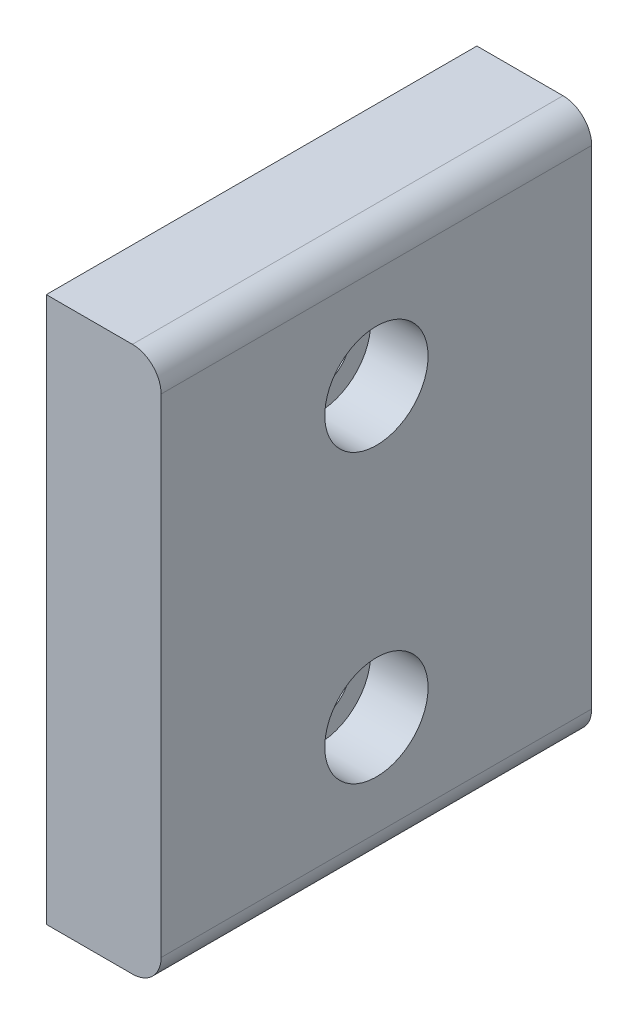
ISO-10303-21;
HEADER;
FILE_DESCRIPTION(('STEP AP214'),'2;1');
FILE_NAME('part.step','',(''),(''),'','','');
FILE_SCHEMA(('AUTOMOTIVE_DESIGN { 1 0 10303 214 1 1 1 1 }'));
ENDSEC;
DATA;
#1=APPLICATION_CONTEXT('core data for automotive mechanical design processes');
#2=APPLICATION_PROTOCOL_DEFINITION('international standard','automotive_design',2000,#1);
#3=PRODUCT_CONTEXT('',#1,'mechanical');
#4=PRODUCT('Part','Part','',(#3));
#5=PRODUCT_RELATED_PRODUCT_CATEGORY('part','',(#4));
#6=PRODUCT_DEFINITION_FORMATION('','',#4);
#7=PRODUCT_DEFINITION_CONTEXT('part definition',#1,'design');
#8=PRODUCT_DEFINITION('design','',#6,#7);
#9=PRODUCT_DEFINITION_SHAPE('','',#8);
#10=(LENGTH_UNIT() NAMED_UNIT(*) SI_UNIT(.MILLI.,.METRE.));
#11=(NAMED_UNIT(*) PLANE_ANGLE_UNIT() SI_UNIT($,.RADIAN.));
#12=(NAMED_UNIT(*) SI_UNIT($,.STERADIAN.) SOLID_ANGLE_UNIT());
#13=UNCERTAINTY_MEASURE_WITH_UNIT(LENGTH_MEASURE(1.E-05),#10,'distance_accuracy_value','');
#14=(GEOMETRIC_REPRESENTATION_CONTEXT(3) GLOBAL_UNCERTAINTY_ASSIGNED_CONTEXT((#13)) GLOBAL_UNIT_ASSIGNED_CONTEXT((#10,
#11,#12)) REPRESENTATION_CONTEXT('',''));
#15=CARTESIAN_POINT('',(0.,0.,0.));
#16=DIRECTION('',(0.,0.,1.));
#17=DIRECTION('',(1.,0.,0.));
#18=AXIS2_PLACEMENT_3D('',#15,#16,#17);
#19=CARTESIAN_POINT('',(4.,5.,0.));
#20=DIRECTION('',(-1.,0.,0.));
#21=DIRECTION('',(0.,0.,1.));
#22=AXIS2_PLACEMENT_3D('',#19,#20,#21);
#23=CYLINDRICAL_SURFACE('',#22,1.1);
#24=CARTESIAN_POINT('',(0.,5.,0.));
#25=DIRECTION('',(1.,0.,0.));
#26=DIRECTION('',(0.,0.,-1.));
#27=AXIS2_PLACEMENT_3D('',#24,#25,#26);
#28=CIRCLE('',#27,1.1);
#29=CARTESIAN_POINT('',(0.,5.,-1.1));
#30=VERTEX_POINT('',#29);
#31=EDGE_CURVE('E113',#30,#30,#28,.T.);
#32=ORIENTED_EDGE('',*,*,#31,.F.);
#33=EDGE_LOOP('',(#32));
#34=FACE_BOUND('',#33,.T.);
#35=CARTESIAN_POINT('',(2.,5.,0.));
#36=DIRECTION('',(1.,0.,0.));
#37=DIRECTION('',(0.,0.,-1.));
#38=AXIS2_PLACEMENT_3D('',#35,#36,#37);
#39=CIRCLE('',#38,1.1);
#40=CARTESIAN_POINT('',(2.,5.,-1.1));
#41=VERTEX_POINT('',#40);
#42=EDGE_CURVE('E133',#41,#41,#39,.T.);
#43=ORIENTED_EDGE('',*,*,#42,.T.);
#44=EDGE_LOOP('',(#43));
#45=FACE_BOUND('',#44,.T.);
#46=ADVANCED_FACE('F35',(#34,#45),#23,.F.);
#47=CARTESIAN_POINT('',(4.,-5.,0.));
#48=DIRECTION('',(-1.,0.,0.));
#49=DIRECTION('',(0.,0.,1.));
#50=AXIS2_PLACEMENT_3D('',#47,#48,#49);
#51=CYLINDRICAL_SURFACE('',#50,1.1);
#52=CARTESIAN_POINT('',(0.,-5.,0.));
#53=DIRECTION('',(1.,0.,0.));
#54=DIRECTION('',(0.,0.,-1.));
#55=AXIS2_PLACEMENT_3D('',#52,#53,#54);
#56=CIRCLE('',#55,1.1);
#57=CARTESIAN_POINT('',(0.,-5.,-1.1));
#58=VERTEX_POINT('',#57);
#59=EDGE_CURVE('E116',#58,#58,#56,.T.);
#60=ORIENTED_EDGE('',*,*,#59,.F.);
#61=EDGE_LOOP('',(#60));
#62=FACE_BOUND('',#61,.T.);
#63=CARTESIAN_POINT('',(2.,-5.,0.));
#64=DIRECTION('',(1.,0.,0.));
#65=DIRECTION('',(0.,0.,-1.));
#66=AXIS2_PLACEMENT_3D('',#63,#64,#65);
#67=CIRCLE('',#66,1.1);
#68=CARTESIAN_POINT('',(2.,-5.,-1.1));
#69=VERTEX_POINT('',#68);
#70=EDGE_CURVE('E130',#69,#69,#67,.T.);
#71=ORIENTED_EDGE('',*,*,#70,.T.);
#72=EDGE_LOOP('',(#71));
#73=FACE_BOUND('',#72,.T.);
#74=ADVANCED_FACE('F185',(#62,#73),#51,.F.);
#75=CARTESIAN_POINT('',(4.,0.,0.));
#76=DIRECTION('',(1.,0.,0.));
#77=DIRECTION('',(0.,0.,-1.));
#78=AXIS2_PLACEMENT_3D('',#75,#76,#77);
#79=PLANE('',#78);
#80=CARTESIAN_POINT('',(4.,5.,0.));
#81=DIRECTION('',(1.,0.,0.));
#82=DIRECTION('',(0.,0.,-1.));
#83=AXIS2_PLACEMENT_3D('',#80,#81,#82);
#84=CIRCLE('',#83,1.8);
#85=CARTESIAN_POINT('',(4.,5.,-1.8));
#86=VERTEX_POINT('',#85);
#87=EDGE_CURVE('E168',#86,#86,#84,.T.);
#88=ORIENTED_EDGE('',*,*,#87,.F.);
#89=EDGE_LOOP('',(#88));
#90=FACE_BOUND('',#89,.T.);
#91=CARTESIAN_POINT('',(4.,-5.,0.));
#92=DIRECTION('',(1.,0.,0.));
#93=DIRECTION('',(0.,0.,-1.));
#94=AXIS2_PLACEMENT_3D('',#91,#92,#93);
#95=CIRCLE('',#94,1.8);
#96=CARTESIAN_POINT('',(4.,-5.,-1.8));
#97=VERTEX_POINT('',#96);
#98=EDGE_CURVE('E162',#97,#97,#95,.T.);
#99=ORIENTED_EDGE('',*,*,#98,.F.);
#100=EDGE_LOOP('',(#99));
#101=FACE_BOUND('',#100,.T.);
#102=DIRECTION('',(0.,-1.,0.));
#103=VECTOR('',#102,1.);
#104=CARTESIAN_POINT('',(4.,9.5,7.50000000000001));
#105=LINE('',#104,#103);
#106=CARTESIAN_POINT('',(4.,8.5,7.50000000000001));
#107=VERTEX_POINT('',#106);
#108=CARTESIAN_POINT('',(4.,-8.5,7.50000000000001));
#109=VERTEX_POINT('',#108);
#110=EDGE_CURVE('E119',#107,#109,#105,.T.);
#111=ORIENTED_EDGE('',*,*,#110,.T.);
#112=DIRECTION('',(0.,0.,-1.));
#113=VECTOR('',#112,1.);
#114=CARTESIAN_POINT('',(4.,-8.5,-7.49999999999999));
#115=LINE('',#114,#113);
#116=CARTESIAN_POINT('',(4.,-8.5,-7.49999999999999));
#117=VERTEX_POINT('',#116);
#118=EDGE_CURVE('E139',#109,#117,#115,.T.);
#119=ORIENTED_EDGE('',*,*,#118,.T.);
#120=DIRECTION('',(0.,1.,0.));
#121=VECTOR('',#120,1.);
#122=CARTESIAN_POINT('',(4.,9.5,-7.49999999999999));
#123=LINE('',#122,#121);
#124=CARTESIAN_POINT('',(4.,8.5,-7.49999999999999));
#125=VERTEX_POINT('',#124);
#126=EDGE_CURVE('E125',#117,#125,#123,.T.);
#127=ORIENTED_EDGE('',*,*,#126,.T.);
#128=DIRECTION('',(0.,0.,1.));
#129=VECTOR('',#128,1.);
#130=CARTESIAN_POINT('',(4.,8.5,7.50000000000001));
#131=LINE('',#130,#129);
#132=EDGE_CURVE('E97',#125,#107,#131,.T.);
#133=ORIENTED_EDGE('',*,*,#132,.T.);
#134=EDGE_LOOP('',(#111,#119,#127,#133));
#135=FACE_BOUND('',#134,.T.);
#136=ADVANCED_FACE('F153',(#90,#101,#135),#79,.T.);
#137=CARTESIAN_POINT('',(0.,0.,0.));
#138=DIRECTION('',(1.,0.,0.));
#139=DIRECTION('',(0.,0.,-1.));
#140=AXIS2_PLACEMENT_3D('',#137,#138,#139);
#141=PLANE('',#140);
#142=DIRECTION('',(0.,1.,0.));
#143=VECTOR('',#142,1.);
#144=CARTESIAN_POINT('',(0.,9.5,-7.49999999999999));
#145=LINE('',#144,#143);
#146=CARTESIAN_POINT('',(0.,-9.5,-7.49999999999999));
#147=VERTEX_POINT('',#146);
#148=CARTESIAN_POINT('',(0.,9.5,-7.49999999999999));
#149=VERTEX_POINT('',#148);
#150=EDGE_CURVE('E105',#147,#149,#145,.T.);
#151=ORIENTED_EDGE('',*,*,#150,.F.);
#152=DIRECTION('',(0.,0.,-1.));
#153=VECTOR('',#152,1.);
#154=CARTESIAN_POINT('',(0.,-9.5,7.50000000000001));
#155=LINE('',#154,#153);
#156=CARTESIAN_POINT('',(0.,-9.5,7.50000000000001));
#157=VERTEX_POINT('',#156);
#158=EDGE_CURVE('E123',#157,#147,#155,.T.);
#159=ORIENTED_EDGE('',*,*,#158,.F.);
#160=DIRECTION('',(0.,-1.,0.));
#161=VECTOR('',#160,1.);
#162=CARTESIAN_POINT('',(0.,9.5,7.50000000000001));
#163=LINE('',#162,#161);
#164=CARTESIAN_POINT('',(0.,9.5,7.50000000000001));
#165=VERTEX_POINT('',#164);
#166=EDGE_CURVE('E107',#165,#157,#163,.T.);
#167=ORIENTED_EDGE('',*,*,#166,.F.);
#168=DIRECTION('',(0.,0.,1.));
#169=VECTOR('',#168,1.);
#170=CARTESIAN_POINT('',(0.,9.5,7.50000000000001));
#171=LINE('',#170,#169);
#172=EDGE_CURVE('E91',#149,#165,#171,.T.);
#173=ORIENTED_EDGE('',*,*,#172,.F.);
#174=EDGE_LOOP('',(#151,#159,#167,#173));
#175=FACE_BOUND('',#174,.T.);
#176=ORIENTED_EDGE('',*,*,#31,.T.);
#177=EDGE_LOOP('',(#176));
#178=FACE_BOUND('',#177,.T.);
#179=ORIENTED_EDGE('',*,*,#59,.T.);
#180=EDGE_LOOP('',(#179));
#181=FACE_BOUND('',#180,.T.);
#182=ADVANCED_FACE('F102',(#175,#178,#181),#141,.F.);
#183=CARTESIAN_POINT('',(4.,9.5,-7.49999999999999));
#184=DIRECTION('',(0.,0.,1.));
#185=DIRECTION('',(1.,0.,0.));
#186=AXIS2_PLACEMENT_3D('',#183,#184,#185);
#187=PLANE('',#186);
#188=ORIENTED_EDGE('',*,*,#126,.F.);
#189=CARTESIAN_POINT('',(3.,-8.5,-7.49999999999999));
#190=DIRECTION('',(0.,0.,1.));
#191=DIRECTION('',(1.,0.,0.));
#192=AXIS2_PLACEMENT_3D('',#189,#190,#191);
#193=CIRCLE('',#192,1.);
#194=CARTESIAN_POINT('',(3.,-9.5,-7.49999999999999));
#195=VERTEX_POINT('',#194);
#196=EDGE_CURVE('E144',#117,#195,#193,.F.);
#197=ORIENTED_EDGE('',*,*,#196,.T.);
#198=DIRECTION('',(-1.,0.,0.));
#199=VECTOR('',#198,1.);
#200=CARTESIAN_POINT('',(4.,-9.5,-7.49999999999999));
#201=LINE('',#200,#199);
#202=EDGE_CURVE('E111',#195,#147,#201,.T.);
#203=ORIENTED_EDGE('',*,*,#202,.T.);
#204=ORIENTED_EDGE('',*,*,#150,.T.);
#205=DIRECTION('',(-1.,0.,0.));
#206=VECTOR('',#205,1.);
#207=CARTESIAN_POINT('',(4.,9.5,-7.49999999999999));
#208=LINE('',#207,#206);
#209=CARTESIAN_POINT('',(3.,9.5,-7.49999999999999));
#210=VERTEX_POINT('',#209);
#211=EDGE_CURVE('E88',#210,#149,#208,.T.);
#212=ORIENTED_EDGE('',*,*,#211,.F.);
#213=CARTESIAN_POINT('',(3.,8.5,-7.49999999999999));
#214=DIRECTION('',(0.,0.,1.));
#215=DIRECTION('',(1.,0.,0.));
#216=AXIS2_PLACEMENT_3D('',#213,#214,#215);
#217=CIRCLE('',#216,1.);
#218=EDGE_CURVE('E142',#210,#125,#217,.F.);
#219=ORIENTED_EDGE('',*,*,#218,.T.);
#220=EDGE_LOOP('',(#188,#197,#203,#204,#212,#219));
#221=FACE_BOUND('',#220,.T.);
#222=ADVANCED_FACE('F110',(#221),#187,.F.);
#223=CARTESIAN_POINT('',(4.,9.5,7.50000000000001));
#224=DIRECTION('',(0.,-1.,0.));
#225=DIRECTION('',(0.,0.,-1.));
#226=AXIS2_PLACEMENT_3D('',#223,#224,#225);
#227=PLANE('',#226);
#228=DIRECTION('',(-1.,0.,0.));
#229=VECTOR('',#228,1.);
#230=CARTESIAN_POINT('',(4.,9.5,7.50000000000001));
#231=LINE('',#230,#229);
#232=CARTESIAN_POINT('',(3.,9.5,7.50000000000001));
#233=VERTEX_POINT('',#232);
#234=EDGE_CURVE('E98',#233,#165,#231,.T.);
#235=ORIENTED_EDGE('',*,*,#234,.F.);
#236=DIRECTION('',(0.,0.,1.));
#237=VECTOR('',#236,1.);
#238=CARTESIAN_POINT('',(3.,9.5,-7.49999999999999));
#239=LINE('',#238,#237);
#240=EDGE_CURVE('E11',#233,#210,#239,.F.);
#241=ORIENTED_EDGE('',*,*,#240,.T.);
#242=ORIENTED_EDGE('',*,*,#211,.T.);
#243=ORIENTED_EDGE('',*,*,#172,.T.);
#244=EDGE_LOOP('',(#235,#241,#242,#243));
#245=FACE_BOUND('',#244,.T.);
#246=ADVANCED_FACE('F90',(#245),#227,.F.);
#247=CARTESIAN_POINT('',(4.,9.5,7.50000000000001));
#248=DIRECTION('',(0.,0.,-1.));
#249=DIRECTION('',(-1.,0.,0.));
#250=AXIS2_PLACEMENT_3D('',#247,#248,#249);
#251=PLANE('',#250);
#252=DIRECTION('',(-1.,0.,0.));
#253=VECTOR('',#252,1.);
#254=CARTESIAN_POINT('',(4.,-9.5,7.50000000000001));
#255=LINE('',#254,#253);
#256=CARTESIAN_POINT('',(3.,-9.5,7.50000000000001));
#257=VERTEX_POINT('',#256);
#258=EDGE_CURVE('E127',#257,#157,#255,.T.);
#259=ORIENTED_EDGE('',*,*,#258,.F.);
#260=CARTESIAN_POINT('',(3.,-8.5,7.50000000000001));
#261=DIRECTION('',(0.,0.,-1.));
#262=DIRECTION('',(-1.,0.,0.));
#263=AXIS2_PLACEMENT_3D('',#260,#261,#262);
#264=CIRCLE('',#263,1.);
#265=EDGE_CURVE('E43',#257,#109,#264,.F.);
#266=ORIENTED_EDGE('',*,*,#265,.T.);
#267=ORIENTED_EDGE('',*,*,#110,.F.);
#268=CARTESIAN_POINT('',(3.,8.5,7.50000000000001));
#269=DIRECTION('',(0.,0.,-1.));
#270=DIRECTION('',(-1.,0.,0.));
#271=AXIS2_PLACEMENT_3D('',#268,#269,#270);
#272=CIRCLE('',#271,1.);
#273=EDGE_CURVE('E50',#107,#233,#272,.F.);
#274=ORIENTED_EDGE('',*,*,#273,.T.);
#275=ORIENTED_EDGE('',*,*,#234,.T.);
#276=ORIENTED_EDGE('',*,*,#166,.T.);
#277=EDGE_LOOP('',(#259,#266,#267,#274,#275,#276));
#278=FACE_BOUND('',#277,.T.);
#279=ADVANCED_FACE('F149',(#278),#251,.F.);
#280=CARTESIAN_POINT('',(4.,-9.5,7.50000000000001));
#281=DIRECTION('',(0.,1.,0.));
#282=DIRECTION('',(0.,0.,1.));
#283=AXIS2_PLACEMENT_3D('',#280,#281,#282);
#284=PLANE('',#283);
#285=ORIENTED_EDGE('',*,*,#202,.F.);
#286=DIRECTION('',(0.,0.,-1.));
#287=VECTOR('',#286,1.);
#288=CARTESIAN_POINT('',(3.,-9.5,7.50000000000001));
#289=LINE('',#288,#287);
#290=EDGE_CURVE('E58',#195,#257,#289,.F.);
#291=ORIENTED_EDGE('',*,*,#290,.T.);
#292=ORIENTED_EDGE('',*,*,#258,.T.);
#293=ORIENTED_EDGE('',*,*,#158,.T.);
#294=EDGE_LOOP('',(#285,#291,#292,#293));
#295=FACE_BOUND('',#294,.T.);
#296=ADVANCED_FACE('F157',(#295),#284,.F.);
#297=CARTESIAN_POINT('',(2.,-5.,0.));
#298=DIRECTION('',(1.,0.,0.));
#299=DIRECTION('',(0.,0.,-1.));
#300=AXIS2_PLACEMENT_3D('',#297,#298,#299);
#301=CYLINDRICAL_SURFACE('',#300,1.8);
#302=CARTESIAN_POINT('',(2.,-5.,0.));
#303=DIRECTION('',(1.,0.,0.));
#304=DIRECTION('',(0.,0.,-1.));
#305=AXIS2_PLACEMENT_3D('',#302,#303,#304);
#306=CIRCLE('',#305,1.8);
#307=CARTESIAN_POINT('',(2.,-5.,-1.8));
#308=VERTEX_POINT('',#307);
#309=EDGE_CURVE('E165',#308,#308,#306,.T.);
#310=ORIENTED_EDGE('',*,*,#309,.F.);
#311=EDGE_LOOP('',(#310));
#312=FACE_BOUND('',#311,.T.);
#313=ORIENTED_EDGE('',*,*,#98,.T.);
#314=EDGE_LOOP('',(#313));
#315=FACE_BOUND('',#314,.T.);
#316=ADVANCED_FACE('F189',(#312,#315),#301,.F.);
#317=CARTESIAN_POINT('',(2.,-5.,0.));
#318=DIRECTION('',(1.,0.,0.));
#319=DIRECTION('',(0.,0.,-1.));
#320=AXIS2_PLACEMENT_3D('',#317,#318,#319);
#321=PLANE('',#320);
#322=ORIENTED_EDGE('',*,*,#70,.F.);
#323=EDGE_LOOP('',(#322));
#324=FACE_BOUND('',#323,.T.);
#325=ORIENTED_EDGE('',*,*,#309,.T.);
#326=EDGE_LOOP('',(#325));
#327=FACE_BOUND('',#326,.T.);
#328=ADVANCED_FACE('F179',(#324,#327),#321,.T.);
#329=CARTESIAN_POINT('',(2.,5.,0.));
#330=DIRECTION('',(1.,0.,0.));
#331=DIRECTION('',(0.,0.,-1.));
#332=AXIS2_PLACEMENT_3D('',#329,#330,#331);
#333=CYLINDRICAL_SURFACE('',#332,1.8);
#334=CARTESIAN_POINT('',(2.,5.,0.));
#335=DIRECTION('',(1.,0.,0.));
#336=DIRECTION('',(0.,0.,-1.));
#337=AXIS2_PLACEMENT_3D('',#334,#335,#336);
#338=CIRCLE('',#337,1.8);
#339=CARTESIAN_POINT('',(2.,5.,-1.8));
#340=VERTEX_POINT('',#339);
#341=EDGE_CURVE('E134',#340,#340,#338,.T.);
#342=ORIENTED_EDGE('',*,*,#341,.F.);
#343=EDGE_LOOP('',(#342));
#344=FACE_BOUND('',#343,.T.);
#345=ORIENTED_EDGE('',*,*,#87,.T.);
#346=EDGE_LOOP('',(#345));
#347=FACE_BOUND('',#346,.T.);
#348=ADVANCED_FACE('F176',(#344,#347),#333,.F.);
#349=CARTESIAN_POINT('',(2.,5.,0.));
#350=DIRECTION('',(1.,0.,0.));
#351=DIRECTION('',(0.,0.,-1.));
#352=AXIS2_PLACEMENT_3D('',#349,#350,#351);
#353=PLANE('',#352);
#354=ORIENTED_EDGE('',*,*,#42,.F.);
#355=EDGE_LOOP('',(#354));
#356=FACE_BOUND('',#355,.T.);
#357=ORIENTED_EDGE('',*,*,#341,.T.);
#358=EDGE_LOOP('',(#357));
#359=FACE_BOUND('',#358,.T.);
#360=ADVANCED_FACE('F174',(#356,#359),#353,.T.);
#361=CARTESIAN_POINT('',(3.,-8.5,0.));
#362=DIRECTION('',(0.,0.,1.));
#363=DIRECTION('',(1.,0.,0.));
#364=AXIS2_PLACEMENT_3D('',#361,#362,#363);
#365=CYLINDRICAL_SURFACE('',#364,1.);
#366=ORIENTED_EDGE('',*,*,#265,.F.);
#367=ORIENTED_EDGE('',*,*,#290,.F.);
#368=ORIENTED_EDGE('',*,*,#196,.F.);
#369=ORIENTED_EDGE('',*,*,#118,.F.);
#370=EDGE_LOOP('',(#366,#367,#368,#369));
#371=FACE_BOUND('',#370,.T.);
#372=ADVANCED_FACE('F156',(#371),#365,.T.);
#373=CARTESIAN_POINT('',(3.,8.5,0.));
#374=DIRECTION('',(0.,0.,-1.));
#375=DIRECTION('',(-1.,0.,0.));
#376=AXIS2_PLACEMENT_3D('',#373,#374,#375);
#377=CYLINDRICAL_SURFACE('',#376,1.);
#378=ORIENTED_EDGE('',*,*,#218,.F.);
#379=ORIENTED_EDGE('',*,*,#240,.F.);
#380=ORIENTED_EDGE('',*,*,#273,.F.);
#381=ORIENTED_EDGE('',*,*,#132,.F.);
#382=EDGE_LOOP('',(#378,#379,#380,#381));
#383=FACE_BOUND('',#382,.T.);
#384=ADVANCED_FACE('F37',(#383),#377,.T.);
#385=CLOSED_SHELL('',(#46,#74,#136,#182,#222,#246,#279,#296,#316,#328,#348,#360,#372,#384));
#386=MANIFOLD_SOLID_BREP('B2',#385);
#387=ADVANCED_BREP_SHAPE_REPRESENTATION('',(#18,#386),#14);
#388=SHAPE_DEFINITION_REPRESENTATION(#9,#387);
ENDSEC;
END-ISO-10303-21;
